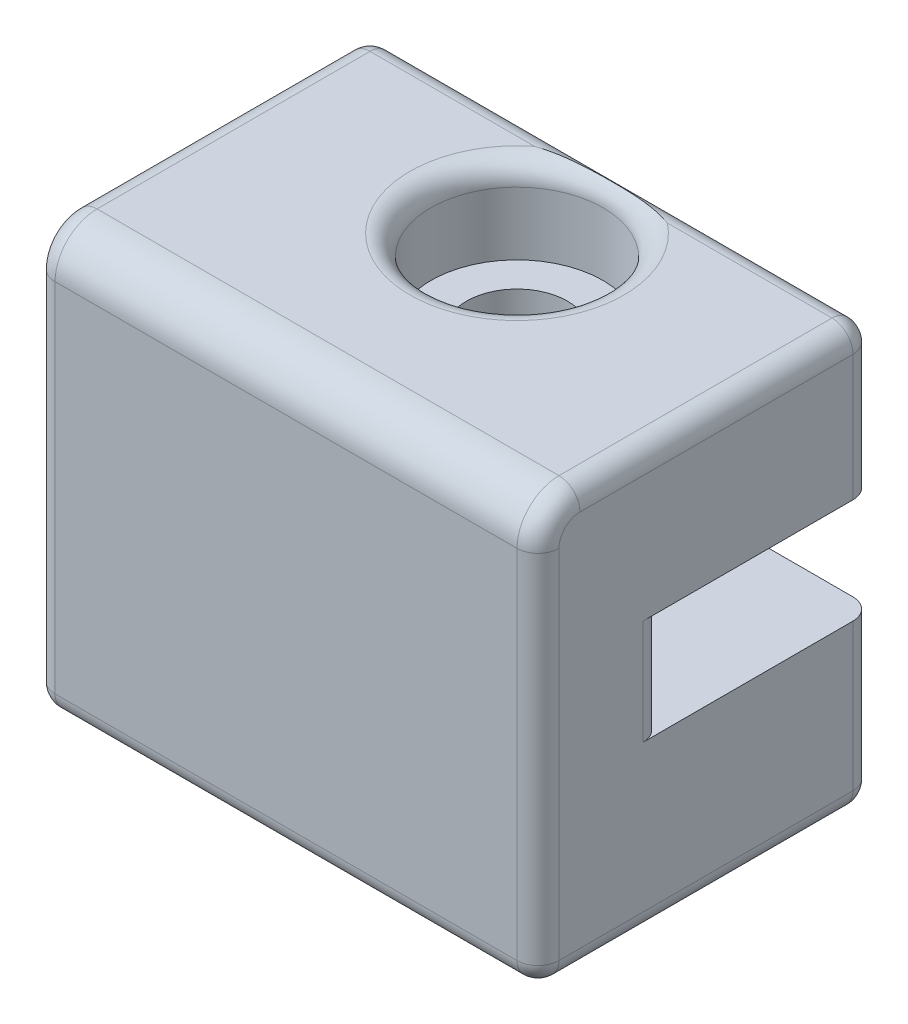
ISO-10303-21;
HEADER;
FILE_DESCRIPTION(('STEP AP214'),'2;1');
FILE_NAME('part.step','',(''),(''),'','','');
FILE_SCHEMA(('AUTOMOTIVE_DESIGN { 1 0 10303 214 1 1 1 1 }'));
ENDSEC;
DATA;
#1=APPLICATION_CONTEXT('core data for automotive mechanical design processes');
#2=APPLICATION_PROTOCOL_DEFINITION('international standard','automotive_design',2000,#1);
#3=PRODUCT_CONTEXT('',#1,'mechanical');
#4=PRODUCT('Part','Part','',(#3));
#5=PRODUCT_RELATED_PRODUCT_CATEGORY('part','',(#4));
#6=PRODUCT_DEFINITION_FORMATION('','',#4);
#7=PRODUCT_DEFINITION_CONTEXT('part definition',#1,'design');
#8=PRODUCT_DEFINITION('design','',#6,#7);
#9=PRODUCT_DEFINITION_SHAPE('','',#8);
#10=(LENGTH_UNIT() NAMED_UNIT(*) SI_UNIT(.MILLI.,.METRE.));
#11=(NAMED_UNIT(*) PLANE_ANGLE_UNIT() SI_UNIT($,.RADIAN.));
#12=(NAMED_UNIT(*) SI_UNIT($,.STERADIAN.) SOLID_ANGLE_UNIT());
#13=UNCERTAINTY_MEASURE_WITH_UNIT(LENGTH_MEASURE(1.E-05),#10,'distance_accuracy_value','');
#14=(GEOMETRIC_REPRESENTATION_CONTEXT(3) GLOBAL_UNCERTAINTY_ASSIGNED_CONTEXT((#13)) GLOBAL_UNIT_ASSIGNED_CONTEXT((#10,
#11,#12)) REPRESENTATION_CONTEXT('',''));
#15=CARTESIAN_POINT('',(0.,0.,0.));
#16=DIRECTION('',(0.,0.,1.));
#17=DIRECTION('',(1.,0.,0.));
#18=AXIS2_PLACEMENT_3D('',#15,#16,#17);
#19=CARTESIAN_POINT('',(0.,11.,0.));
#20=DIRECTION('',(0.,-1.,0.));
#21=DIRECTION('',(0.,0.,-1.));
#22=AXIS2_PLACEMENT_3D('',#19,#20,#21);
#23=CYLINDRICAL_SURFACE('',#22,1.2);
#24=CARTESIAN_POINT('',(0.,6.5,0.));
#25=DIRECTION('',(0.,-1.,0.));
#26=DIRECTION('',(0.,0.,-1.));
#27=AXIS2_PLACEMENT_3D('',#24,#25,#26);
#28=CIRCLE('',#27,1.2);
#29=CARTESIAN_POINT('',(0.,6.5,-1.2));
#30=VERTEX_POINT('',#29);
#31=EDGE_CURVE('E518',#30,#30,#28,.F.);
#32=ORIENTED_EDGE('',*,*,#31,.F.);
#33=EDGE_LOOP('',(#32));
#34=FACE_BOUND('',#33,.T.);
#35=CARTESIAN_POINT('',(0.,8.,0.));
#36=DIRECTION('',(0.,1.,0.));
#37=DIRECTION('',(0.,0.,1.));
#38=AXIS2_PLACEMENT_3D('',#35,#36,#37);
#39=CIRCLE('',#38,1.2);
#40=CARTESIAN_POINT('',(0.,8.,1.2));
#41=VERTEX_POINT('',#40);
#42=EDGE_CURVE('E544',#41,#41,#39,.T.);
#43=ORIENTED_EDGE('',*,*,#42,.T.);
#44=EDGE_LOOP('',(#43));
#45=FACE_BOUND('',#44,.T.);
#46=ADVANCED_FACE('F47',(#34,#45),#23,.F.);
#47=CARTESIAN_POINT('',(6.,4.,2.5));
#48=DIRECTION('',(-1.,0.,0.));
#49=DIRECTION('',(0.,0.,1.));
#50=AXIS2_PLACEMENT_3D('',#47,#48,#49);
#51=PLANE('',#50);
#52=CARTESIAN_POINT('',(6.,9.,4.5));
#53=DIRECTION('',(-1.,0.,0.));
#54=DIRECTION('',(0.,0.,1.));
#55=AXIS2_PLACEMENT_3D('',#52,#53,#54);
#56=CIRCLE('',#55,0.5);
#57=CARTESIAN_POINT('',(6.,9.5,4.5));
#58=VERTEX_POINT('',#57);
#59=CARTESIAN_POINT('',(6.,9.,5.));
#60=VERTEX_POINT('',#59);
#61=EDGE_CURVE('E344',#58,#60,#56,.F.);
#62=ORIENTED_EDGE('',*,*,#61,.T.);
#63=DIRECTION('',(0.,1.,0.));
#64=VECTOR('',#63,1.);
#65=CARTESIAN_POINT('',(6.,4.,5.));
#66=LINE('',#65,#64);
#67=CARTESIAN_POINT('',(6.,0.5,5.));
#68=VERTEX_POINT('',#67);
#69=EDGE_CURVE('E347',#60,#68,#66,.F.);
#70=ORIENTED_EDGE('',*,*,#69,.T.);
#71=DIRECTION('',(0.,0.,-1.));
#72=VECTOR('',#71,1.);
#73=CARTESIAN_POINT('',(6.,0.5,-2.5));
#74=LINE('',#73,#72);
#75=CARTESIAN_POINT('',(6.,0.5,-2.));
#76=VERTEX_POINT('',#75);
#77=EDGE_CURVE('E241',#68,#76,#74,.T.);
#78=ORIENTED_EDGE('',*,*,#77,.T.);
#79=DIRECTION('',(0.,-1.,0.));
#80=VECTOR('',#79,1.);
#81=CARTESIAN_POINT('',(6.,4.,-2.));
#82=LINE('',#81,#80);
#83=CARTESIAN_POINT('',(6.,4.,-2.));
#84=VERTEX_POINT('',#83);
#85=EDGE_CURVE('E244',#76,#84,#82,.F.);
#86=ORIENTED_EDGE('',*,*,#85,.T.);
#87=DIRECTION('',(0.,0.,-1.));
#88=VECTOR('',#87,1.);
#89=CARTESIAN_POINT('',(6.,4.,2.5));
#90=LINE('',#89,#88);
#91=CARTESIAN_POINT('',(6.,4.,3.));
#92=VERTEX_POINT('',#91);
#93=EDGE_CURVE('E533',#92,#84,#90,.T.);
#94=ORIENTED_EDGE('',*,*,#93,.F.);
#95=DIRECTION('',(0.,1.,0.));
#96=VECTOR('',#95,1.);
#97=CARTESIAN_POINT('',(6.,6.5,3.));
#98=LINE('',#97,#96);
#99=CARTESIAN_POINT('',(6.,6.5,3.));
#100=VERTEX_POINT('',#99);
#101=EDGE_CURVE('E247',#92,#100,#98,.T.);
#102=ORIENTED_EDGE('',*,*,#101,.T.);
#103=DIRECTION('',(0.,0.,-1.));
#104=VECTOR('',#103,1.);
#105=CARTESIAN_POINT('',(6.,6.5,5.5));
#106=LINE('',#105,#104);
#107=CARTESIAN_POINT('',(6.,6.5,-2.));
#108=VERTEX_POINT('',#107);
#109=EDGE_CURVE('E516',#100,#108,#106,.T.);
#110=ORIENTED_EDGE('',*,*,#109,.T.);
#111=DIRECTION('',(0.,-1.,0.));
#112=VECTOR('',#111,1.);
#113=CARTESIAN_POINT('',(6.,4.,-2.));
#114=LINE('',#113,#112);
#115=CARTESIAN_POINT('',(6.,9.5,-2.));
#116=VERTEX_POINT('',#115);
#117=EDGE_CURVE('E341',#108,#116,#114,.F.);
#118=ORIENTED_EDGE('',*,*,#117,.T.);
#119=DIRECTION('',(0.,0.,-1.));
#120=VECTOR('',#119,1.);
#121=CARTESIAN_POINT('',(6.,9.5,2.5));
#122=LINE('',#121,#120);
#123=EDGE_CURVE('E338',#116,#58,#122,.F.);
#124=ORIENTED_EDGE('',*,*,#123,.T.);
#125=EDGE_LOOP('',(#62,#70,#78,#86,#94,#102,#110,#118,#124));
#126=FACE_BOUND('',#125,.T.);
#127=ADVANCED_FACE('F475',(#126),#51,.F.);
#128=CARTESIAN_POINT('',(-6.,4.,-2.5));
#129=DIRECTION('',(0.,0.,1.));
#130=DIRECTION('',(1.,0.,0.));
#131=AXIS2_PLACEMENT_3D('',#128,#129,#130);
#132=PLANE('',#131);
#133=DIRECTION('',(-1.,0.,0.));
#134=VECTOR('',#133,1.);
#135=CARTESIAN_POINT('',(-6.,0.5,-2.5));
#136=LINE('',#135,#134);
#137=CARTESIAN_POINT('',(5.5,0.5,-2.5));
#138=VERTEX_POINT('',#137);
#139=CARTESIAN_POINT('',(-5.5,0.5,-2.5));
#140=VERTEX_POINT('',#139);
#141=EDGE_CURVE('E251',#138,#140,#136,.T.);
#142=ORIENTED_EDGE('',*,*,#141,.T.);
#143=DIRECTION('',(0.,-1.,0.));
#144=VECTOR('',#143,1.);
#145=CARTESIAN_POINT('',(-5.5,4.,-2.5));
#146=LINE('',#145,#144);
#147=CARTESIAN_POINT('',(-5.5,4.,-2.5));
#148=VERTEX_POINT('',#147);
#149=EDGE_CURVE('E257',#140,#148,#146,.F.);
#150=ORIENTED_EDGE('',*,*,#149,.T.);
#151=DIRECTION('',(-1.,0.,0.));
#152=VECTOR('',#151,1.);
#153=CARTESIAN_POINT('',(-6.,4.,-2.5));
#154=LINE('',#153,#152);
#155=CARTESIAN_POINT('',(5.5,4.,-2.5));
#156=VERTEX_POINT('',#155);
#157=EDGE_CURVE('E203',#156,#148,#154,.T.);
#158=ORIENTED_EDGE('',*,*,#157,.F.);
#159=DIRECTION('',(0.,-1.,0.));
#160=VECTOR('',#159,1.);
#161=CARTESIAN_POINT('',(5.5,4.,-2.5));
#162=LINE('',#161,#160);
#163=EDGE_CURVE('E254',#156,#138,#162,.T.);
#164=ORIENTED_EDGE('',*,*,#163,.T.);
#165=EDGE_LOOP('',(#142,#150,#158,#164));
#166=FACE_BOUND('',#165,.T.);
#167=ADVANCED_FACE('F484',(#166),#132,.F.);
#168=CARTESIAN_POINT('',(-6.,4.,2.5));
#169=DIRECTION('',(1.,0.,0.));
#170=DIRECTION('',(0.,0.,-1.));
#171=AXIS2_PLACEMENT_3D('',#168,#169,#170);
#172=PLANE('',#171);
#173=DIRECTION('',(0.,0.,1.));
#174=VECTOR('',#173,1.);
#175=CARTESIAN_POINT('',(-6.,0.5,5.5));
#176=LINE('',#175,#174);
#177=CARTESIAN_POINT('',(-6.,0.5,-2.));
#178=VERTEX_POINT('',#177);
#179=CARTESIAN_POINT('',(-6.,0.5,5.));
#180=VERTEX_POINT('',#179);
#181=EDGE_CURVE('E227',#178,#180,#176,.T.);
#182=ORIENTED_EDGE('',*,*,#181,.T.);
#183=DIRECTION('',(0.,-1.,0.));
#184=VECTOR('',#183,1.);
#185=CARTESIAN_POINT('',(-6.,4.,5.));
#186=LINE('',#185,#184);
#187=CARTESIAN_POINT('',(-6.,9.,5.));
#188=VERTEX_POINT('',#187);
#189=EDGE_CURVE('E368',#180,#188,#186,.F.);
#190=ORIENTED_EDGE('',*,*,#189,.T.);
#191=CARTESIAN_POINT('',(-6.,9.,4.5));
#192=DIRECTION('',(1.,0.,0.));
#193=DIRECTION('',(0.,0.,-1.));
#194=AXIS2_PLACEMENT_3D('',#191,#192,#193);
#195=CIRCLE('',#194,0.5);
#196=CARTESIAN_POINT('',(-6.,9.5,4.5));
#197=VERTEX_POINT('',#196);
#198=EDGE_CURVE('E365',#188,#197,#195,.F.);
#199=ORIENTED_EDGE('',*,*,#198,.T.);
#200=DIRECTION('',(0.,0.,1.));
#201=VECTOR('',#200,1.);
#202=CARTESIAN_POINT('',(-6.,9.5,2.5));
#203=LINE('',#202,#201);
#204=CARTESIAN_POINT('',(-6.,9.5,-2.));
#205=VERTEX_POINT('',#204);
#206=EDGE_CURVE('E362',#197,#205,#203,.F.);
#207=ORIENTED_EDGE('',*,*,#206,.T.);
#208=DIRECTION('',(0.,-1.,0.));
#209=VECTOR('',#208,1.);
#210=CARTESIAN_POINT('',(-6.,4.,-2.));
#211=LINE('',#210,#209);
#212=CARTESIAN_POINT('',(-6.,6.5,-2.));
#213=VERTEX_POINT('',#212);
#214=EDGE_CURVE('E359',#205,#213,#211,.T.);
#215=ORIENTED_EDGE('',*,*,#214,.T.);
#216=DIRECTION('',(0.,0.,1.));
#217=VECTOR('',#216,1.);
#218=CARTESIAN_POINT('',(-6.,6.5,5.5));
#219=LINE('',#218,#217);
#220=CARTESIAN_POINT('',(-6.,6.5,3.));
#221=VERTEX_POINT('',#220);
#222=EDGE_CURVE('E512',#213,#221,#219,.T.);
#223=ORIENTED_EDGE('',*,*,#222,.T.);
#224=DIRECTION('',(0.,-1.,0.));
#225=VECTOR('',#224,1.);
#226=CARTESIAN_POINT('',(-6.,4.,3.));
#227=LINE('',#226,#225);
#228=CARTESIAN_POINT('',(-6.,4.,3.));
#229=VERTEX_POINT('',#228);
#230=EDGE_CURVE('E218',#221,#229,#227,.T.);
#231=ORIENTED_EDGE('',*,*,#230,.T.);
#232=DIRECTION('',(0.,0.,1.));
#233=VECTOR('',#232,1.);
#234=CARTESIAN_POINT('',(-6.,4.,2.5));
#235=LINE('',#234,#233);
#236=CARTESIAN_POINT('',(-6.,4.,-2.));
#237=VERTEX_POINT('',#236);
#238=EDGE_CURVE('E200',#237,#229,#235,.T.);
#239=ORIENTED_EDGE('',*,*,#238,.F.);
#240=DIRECTION('',(0.,-1.,0.));
#241=VECTOR('',#240,1.);
#242=CARTESIAN_POINT('',(-6.,4.,-2.));
#243=LINE('',#242,#241);
#244=EDGE_CURVE('E216',#237,#178,#243,.T.);
#245=ORIENTED_EDGE('',*,*,#244,.T.);
#246=EDGE_LOOP('',(#182,#190,#199,#207,#215,#223,#231,#239,#245));
#247=FACE_BOUND('',#246,.T.);
#248=ADVANCED_FACE('F215',(#247),#172,.F.);
#249=CARTESIAN_POINT('',(0.,4.,0.));
#250=DIRECTION('',(0.,-1.,0.));
#251=DIRECTION('',(0.,0.,-1.));
#252=AXIS2_PLACEMENT_3D('',#249,#250,#251);
#253=PLANE('',#252);
#254=CARTESIAN_POINT('',(0.,4.,0.));
#255=DIRECTION('',(0.,-1.,0.));
#256=DIRECTION('',(0.,0.,-1.));
#257=AXIS2_PLACEMENT_3D('',#254,#255,#256);
#258=CIRCLE('',#257,1.2);
#259=CARTESIAN_POINT('',(0.,4.,-1.2));
#260=VERTEX_POINT('',#259);
#261=EDGE_CURVE('E509',#260,#260,#258,.F.);
#262=ORIENTED_EDGE('',*,*,#261,.F.);
#263=EDGE_LOOP('',(#262));
#264=FACE_BOUND('',#263,.T.);
#265=ORIENTED_EDGE('',*,*,#157,.T.);
#266=CARTESIAN_POINT('',(-5.5,4.,-2.));
#267=DIRECTION('',(0.,-1.,0.));
#268=DIRECTION('',(0.,0.,-1.));
#269=AXIS2_PLACEMENT_3D('',#266,#267,#268);
#270=CIRCLE('',#269,0.5);
#271=EDGE_CURVE('E197',#148,#237,#270,.F.);
#272=ORIENTED_EDGE('',*,*,#271,.T.);
#273=ORIENTED_EDGE('',*,*,#238,.T.);
#274=CARTESIAN_POINT('',(-5.5,4.,3.));
#275=DIRECTION('',(0.,-1.,0.));
#276=DIRECTION('',(0.,0.,-1.));
#277=AXIS2_PLACEMENT_3D('',#274,#275,#276);
#278=CIRCLE('',#277,0.5);
#279=CARTESIAN_POINT('',(-5.5,4.,2.5));
#280=VERTEX_POINT('',#279);
#281=EDGE_CURVE('E280',#229,#280,#278,.T.);
#282=ORIENTED_EDGE('',*,*,#281,.T.);
#283=DIRECTION('',(1.,0.,0.));
#284=VECTOR('',#283,1.);
#285=CARTESIAN_POINT('',(-6.,4.,2.5));
#286=LINE('',#285,#284);
#287=CARTESIAN_POINT('',(5.5,4.,2.5));
#288=VERTEX_POINT('',#287);
#289=EDGE_CURVE('E220',#280,#288,#286,.T.);
#290=ORIENTED_EDGE('',*,*,#289,.T.);
#291=CARTESIAN_POINT('',(5.5,4.,3.));
#292=DIRECTION('',(0.,-1.,0.));
#293=DIRECTION('',(0.,0.,-1.));
#294=AXIS2_PLACEMENT_3D('',#291,#292,#293);
#295=CIRCLE('',#294,0.5);
#296=EDGE_CURVE('E290',#288,#92,#295,.T.);
#297=ORIENTED_EDGE('',*,*,#296,.T.);
#298=ORIENTED_EDGE('',*,*,#93,.T.);
#299=CARTESIAN_POINT('',(5.5,4.,-2.));
#300=DIRECTION('',(0.,-1.,0.));
#301=DIRECTION('',(0.,0.,-1.));
#302=AXIS2_PLACEMENT_3D('',#299,#300,#301);
#303=CIRCLE('',#302,0.5);
#304=EDGE_CURVE('E209',#84,#156,#303,.F.);
#305=ORIENTED_EDGE('',*,*,#304,.T.);
#306=EDGE_LOOP('',(#265,#272,#273,#282,#290,#297,#298,#305));
#307=FACE_BOUND('',#306,.T.);
#308=ADVANCED_FACE('F199',(#264,#307),#253,.F.);
#309=CARTESIAN_POINT('',(0.,0.,0.));
#310=DIRECTION('',(0.,-1.,0.));
#311=DIRECTION('',(0.,0.,-1.));
#312=AXIS2_PLACEMENT_3D('',#309,#310,#311);
#313=PLANE('',#312);
#314=DIRECTION('',(0.,0.,1.));
#315=VECTOR('',#314,1.);
#316=CARTESIAN_POINT('',(-5.5,0.,-2.5));
#317=LINE('',#316,#315);
#318=CARTESIAN_POINT('',(-5.5,0.,5.));
#319=VERTEX_POINT('',#318);
#320=CARTESIAN_POINT('',(-5.5,0.,-2.));
#321=VERTEX_POINT('',#320);
#322=EDGE_CURVE('E269',#319,#321,#317,.F.);
#323=ORIENTED_EDGE('',*,*,#322,.T.);
#324=DIRECTION('',(-1.,0.,0.));
#325=VECTOR('',#324,1.);
#326=CARTESIAN_POINT('',(6.,0.,-2.));
#327=LINE('',#326,#325);
#328=CARTESIAN_POINT('',(5.5,0.,-2.));
#329=VERTEX_POINT('',#328);
#330=EDGE_CURVE('E272',#321,#329,#327,.F.);
#331=ORIENTED_EDGE('',*,*,#330,.T.);
#332=DIRECTION('',(0.,0.,-1.));
#333=VECTOR('',#332,1.);
#334=CARTESIAN_POINT('',(5.5,0.,5.5));
#335=LINE('',#334,#333);
#336=CARTESIAN_POINT('',(5.5,0.,5.));
#337=VERTEX_POINT('',#336);
#338=EDGE_CURVE('E265',#329,#337,#335,.F.);
#339=ORIENTED_EDGE('',*,*,#338,.T.);
#340=DIRECTION('',(1.,0.,0.));
#341=VECTOR('',#340,1.);
#342=CARTESIAN_POINT('',(-6.,0.,5.));
#343=LINE('',#342,#341);
#344=EDGE_CURVE('E208',#337,#319,#343,.F.);
#345=ORIENTED_EDGE('',*,*,#344,.T.);
#346=EDGE_LOOP('',(#323,#331,#339,#345));
#347=FACE_BOUND('',#346,.T.);
#348=CARTESIAN_POINT('',(0.,0.,0.));
#349=DIRECTION('',(0.,-1.,0.));
#350=DIRECTION('',(0.,0.,-1.));
#351=AXIS2_PLACEMENT_3D('',#348,#349,#350);
#352=CIRCLE('',#351,1.2);
#353=CARTESIAN_POINT('',(0.,0.,-1.2));
#354=VERTEX_POINT('',#353);
#355=EDGE_CURVE('E506',#354,#354,#352,.F.);
#356=ORIENTED_EDGE('',*,*,#355,.T.);
#357=EDGE_LOOP('',(#356));
#358=FACE_BOUND('',#357,.T.);
#359=ADVANCED_FACE('F672',(#347,#358),#313,.T.);
#360=CARTESIAN_POINT('',(0.,0.,2.5));
#361=DIRECTION('',(0.,0.,-1.));
#362=DIRECTION('',(-1.,0.,0.));
#363=AXIS2_PLACEMENT_3D('',#360,#361,#362);
#364=PLANE('',#363);
#365=ORIENTED_EDGE('',*,*,#289,.F.);
#366=DIRECTION('',(0.,-1.,0.));
#367=VECTOR('',#366,1.);
#368=CARTESIAN_POINT('',(-5.5,6.5,2.5));
#369=LINE('',#368,#367);
#370=CARTESIAN_POINT('',(-5.5,6.5,2.5));
#371=VERTEX_POINT('',#370);
#372=EDGE_CURVE('E238',#280,#371,#369,.F.);
#373=ORIENTED_EDGE('',*,*,#372,.T.);
#374=DIRECTION('',(-1.,0.,0.));
#375=VECTOR('',#374,1.);
#376=CARTESIAN_POINT('',(-6.,6.5,2.5));
#377=LINE('',#376,#375);
#378=CARTESIAN_POINT('',(5.5,6.5,2.5));
#379=VERTEX_POINT('',#378);
#380=EDGE_CURVE('E529',#379,#371,#377,.T.);
#381=ORIENTED_EDGE('',*,*,#380,.F.);
#382=DIRECTION('',(0.,1.,0.));
#383=VECTOR('',#382,1.);
#384=CARTESIAN_POINT('',(5.5,4.,2.5));
#385=LINE('',#384,#383);
#386=EDGE_CURVE('E231',#379,#288,#385,.F.);
#387=ORIENTED_EDGE('',*,*,#386,.T.);
#388=EDGE_LOOP('',(#365,#373,#381,#387));
#389=FACE_BOUND('',#388,.T.);
#390=ADVANCED_FACE('F642',(#389),#364,.T.);
#391=CARTESIAN_POINT('',(0.,0.,5.5));
#392=DIRECTION('',(0.,0.,-1.));
#393=DIRECTION('',(-1.,0.,0.));
#394=AXIS2_PLACEMENT_3D('',#391,#392,#393);
#395=PLANE('',#394);
#396=DIRECTION('',(1.,0.,0.));
#397=VECTOR('',#396,1.);
#398=CARTESIAN_POINT('',(6.,0.5,5.5));
#399=LINE('',#398,#397);
#400=CARTESIAN_POINT('',(-5.5,0.5,5.5));
#401=VERTEX_POINT('',#400);
#402=CARTESIAN_POINT('',(5.5,0.5,5.5));
#403=VERTEX_POINT('',#402);
#404=EDGE_CURVE('E276',#401,#403,#399,.T.);
#405=ORIENTED_EDGE('',*,*,#404,.T.);
#406=DIRECTION('',(0.,1.,0.));
#407=VECTOR('',#406,1.);
#408=CARTESIAN_POINT('',(5.5,0.,5.5));
#409=LINE('',#408,#407);
#410=CARTESIAN_POINT('',(5.5,9.,5.5));
#411=VERTEX_POINT('',#410);
#412=EDGE_CURVE('E335',#403,#411,#409,.T.);
#413=ORIENTED_EDGE('',*,*,#412,.T.);
#414=DIRECTION('',(1.,0.,0.));
#415=VECTOR('',#414,1.);
#416=CARTESIAN_POINT('',(0.,9.,5.5));
#417=LINE('',#416,#415);
#418=CARTESIAN_POINT('',(-5.5,9.,5.5));
#419=VERTEX_POINT('',#418);
#420=EDGE_CURVE('E318',#411,#419,#417,.F.);
#421=ORIENTED_EDGE('',*,*,#420,.T.);
#422=DIRECTION('',(0.,-1.,0.));
#423=VECTOR('',#422,1.);
#424=CARTESIAN_POINT('',(-5.5,0.,5.5));
#425=LINE('',#424,#423);
#426=EDGE_CURVE('E332',#419,#401,#425,.T.);
#427=ORIENTED_EDGE('',*,*,#426,.T.);
#428=EDGE_LOOP('',(#405,#413,#421,#427));
#429=FACE_BOUND('',#428,.T.);
#430=ADVANCED_FACE('F722',(#429),#395,.F.);
#431=CARTESIAN_POINT('',(-6.,10.,-2.5));
#432=DIRECTION('',(0.,0.,1.));
#433=DIRECTION('',(1.,0.,0.));
#434=AXIS2_PLACEMENT_3D('',#431,#432,#433);
#435=PLANE('',#434);
#436=DIRECTION('',(-1.,0.,0.));
#437=VECTOR('',#436,1.);
#438=CARTESIAN_POINT('',(-6.,9.5,-2.5));
#439=LINE('',#438,#437);
#440=CARTESIAN_POINT('',(-5.5,9.5,-2.5));
#441=VERTEX_POINT('',#440);
#442=CARTESIAN_POINT('',(5.5,9.5,-2.5));
#443=VERTEX_POINT('',#442);
#444=EDGE_CURVE('E374',#441,#443,#439,.F.);
#445=ORIENTED_EDGE('',*,*,#444,.T.);
#446=DIRECTION('',(0.,-1.,0.));
#447=VECTOR('',#446,1.);
#448=CARTESIAN_POINT('',(5.5,10.,-2.5));
#449=LINE('',#448,#447);
#450=CARTESIAN_POINT('',(5.5,6.5,-2.5));
#451=VERTEX_POINT('',#450);
#452=EDGE_CURVE('E377',#443,#451,#449,.T.);
#453=ORIENTED_EDGE('',*,*,#452,.T.);
#454=DIRECTION('',(-1.,0.,0.));
#455=VECTOR('',#454,1.);
#456=CARTESIAN_POINT('',(-6.,6.5,-2.5));
#457=LINE('',#456,#455);
#458=CARTESIAN_POINT('',(-5.5,6.5,-2.5));
#459=VERTEX_POINT('',#458);
#460=EDGE_CURVE('E525',#451,#459,#457,.T.);
#461=ORIENTED_EDGE('',*,*,#460,.T.);
#462=DIRECTION('',(0.,-1.,0.));
#463=VECTOR('',#462,1.);
#464=CARTESIAN_POINT('',(-5.5,10.,-2.5));
#465=LINE('',#464,#463);
#466=EDGE_CURVE('E371',#459,#441,#465,.F.);
#467=ORIENTED_EDGE('',*,*,#466,.T.);
#468=EDGE_LOOP('',(#445,#453,#461,#467));
#469=FACE_BOUND('',#468,.T.);
#470=ADVANCED_FACE('F653',(#469),#435,.F.);
#471=CARTESIAN_POINT('',(0.,10.,0.));
#472=DIRECTION('',(0.,-1.,0.));
#473=DIRECTION('',(0.,0.,-1.));
#474=AXIS2_PLACEMENT_3D('',#471,#472,#473);
#475=PLANE('',#474);
#476=DIRECTION('',(1.,0.,0.));
#477=VECTOR('',#476,1.);
#478=CARTESIAN_POINT('',(0.,10.,4.5));
#479=LINE('',#478,#477);
#480=CARTESIAN_POINT('',(-5.5,10.,4.5));
#481=VERTEX_POINT('',#480);
#482=CARTESIAN_POINT('',(5.5,10.,4.5));
#483=VERTEX_POINT('',#482);
#484=EDGE_CURVE('E294',#481,#483,#479,.T.);
#485=ORIENTED_EDGE('',*,*,#484,.T.);
#486=DIRECTION('',(0.,0.,-1.));
#487=VECTOR('',#486,1.);
#488=CARTESIAN_POINT('',(5.5,10.,0.));
#489=LINE('',#488,#487);
#490=CARTESIAN_POINT('',(5.5,10.,-2.));
#491=VERTEX_POINT('',#490);
#492=EDGE_CURVE('E57',#483,#491,#489,.T.);
#493=ORIENTED_EDGE('',*,*,#492,.T.);
#494=DIRECTION('',(-1.,0.,0.));
#495=VECTOR('',#494,1.);
#496=CARTESIAN_POINT('',(0.,10.,-2.));
#497=LINE('',#496,#495);
#498=CARTESIAN_POINT('',(1.58192920195564,10.,-2.));
#499=VERTEX_POINT('',#498);
#500=EDGE_CURVE('E68',#491,#499,#497,.T.);
#501=ORIENTED_EDGE('',*,*,#500,.T.);
#502=CARTESIAN_POINT('',(0.,10.,0.));
#503=DIRECTION('',(0.,-1.,0.));
#504=DIRECTION('',(0.,0.,-1.));
#505=AXIS2_PLACEMENT_3D('',#502,#503,#504);
#506=CIRCLE('',#505,2.55);
#507=CARTESIAN_POINT('',(-1.58192920195564,10.,-2.));
#508=VERTEX_POINT('',#507);
#509=EDGE_CURVE('E392',#499,#508,#506,.T.);
#510=ORIENTED_EDGE('',*,*,#509,.T.);
#511=DIRECTION('',(-1.,0.,0.));
#512=VECTOR('',#511,1.);
#513=CARTESIAN_POINT('',(0.,10.,-2.));
#514=LINE('',#513,#512);
#515=CARTESIAN_POINT('',(-5.5,10.,-2.));
#516=VERTEX_POINT('',#515);
#517=EDGE_CURVE('E389',#508,#516,#514,.T.);
#518=ORIENTED_EDGE('',*,*,#517,.T.);
#519=DIRECTION('',(0.,0.,1.));
#520=VECTOR('',#519,1.);
#521=CARTESIAN_POINT('',(-5.5,10.,0.));
#522=LINE('',#521,#520);
#523=EDGE_CURVE('E386',#516,#481,#522,.T.);
#524=ORIENTED_EDGE('',*,*,#523,.T.);
#525=EDGE_LOOP('',(#485,#493,#501,#510,#518,#524));
#526=FACE_BOUND('',#525,.T.);
#527=ADVANCED_FACE('F500',(#526),#475,.F.);
#528=CARTESIAN_POINT('',(0.,6.5,0.));
#529=DIRECTION('',(0.,-1.,0.));
#530=DIRECTION('',(0.,0.,-1.));
#531=AXIS2_PLACEMENT_3D('',#528,#529,#530);
#532=PLANE('',#531);
#533=ORIENTED_EDGE('',*,*,#31,.T.);
#534=EDGE_LOOP('',(#533));
#535=FACE_BOUND('',#534,.T.);
#536=ORIENTED_EDGE('',*,*,#460,.F.);
#537=CARTESIAN_POINT('',(5.5,6.5,-2.));
#538=DIRECTION('',(0.,-1.,0.));
#539=DIRECTION('',(0.,0.,-1.));
#540=AXIS2_PLACEMENT_3D('',#537,#538,#539);
#541=CIRCLE('',#540,0.5);
#542=EDGE_CURVE('E383',#451,#108,#541,.T.);
#543=ORIENTED_EDGE('',*,*,#542,.T.);
#544=ORIENTED_EDGE('',*,*,#109,.F.);
#545=CARTESIAN_POINT('',(5.5,6.5,3.));
#546=DIRECTION('',(0.,-1.,0.));
#547=DIRECTION('',(0.,0.,-1.));
#548=AXIS2_PLACEMENT_3D('',#545,#546,#547);
#549=CIRCLE('',#548,0.5);
#550=EDGE_CURVE('E287',#100,#379,#549,.F.);
#551=ORIENTED_EDGE('',*,*,#550,.T.);
#552=ORIENTED_EDGE('',*,*,#380,.T.);
#553=CARTESIAN_POINT('',(-5.5,6.5,3.));
#554=DIRECTION('',(0.,-1.,0.));
#555=DIRECTION('',(0.,0.,-1.));
#556=AXIS2_PLACEMENT_3D('',#553,#554,#555);
#557=CIRCLE('',#556,0.5);
#558=EDGE_CURVE('E283',#371,#221,#557,.F.);
#559=ORIENTED_EDGE('',*,*,#558,.T.);
#560=ORIENTED_EDGE('',*,*,#222,.F.);
#561=CARTESIAN_POINT('',(-5.5,6.5,-2.));
#562=DIRECTION('',(0.,-1.,0.));
#563=DIRECTION('',(0.,0.,-1.));
#564=AXIS2_PLACEMENT_3D('',#561,#562,#563);
#565=CIRCLE('',#564,0.5);
#566=EDGE_CURVE('E380',#213,#459,#565,.T.);
#567=ORIENTED_EDGE('',*,*,#566,.T.);
#568=EDGE_LOOP('',(#536,#543,#544,#551,#552,#559,#560,#567));
#569=FACE_BOUND('',#568,.T.);
#570=ADVANCED_FACE('F492',(#535,#569),#532,.T.);
#571=ORIENTED_EDGE('',*,*,#355,.F.);
#572=EDGE_LOOP('',(#571));
#573=FACE_BOUND('',#572,.T.);
#574=ORIENTED_EDGE('',*,*,#261,.T.);
#575=EDGE_LOOP('',(#574));
#576=FACE_BOUND('',#575,.T.);
#577=ADVANCED_FACE('F478',(#573,#576),#23,.F.);
#578=CARTESIAN_POINT('',(0.,8.,0.));
#579=DIRECTION('',(0.,1.,0.));
#580=DIRECTION('',(0.,0.,1.));
#581=AXIS2_PLACEMENT_3D('',#578,#579,#580);
#582=CYLINDRICAL_SURFACE('',#581,2.05);
#583=CARTESIAN_POINT('',(0.,9.5,0.));
#584=DIRECTION('',(0.,-1.,0.));
#585=DIRECTION('',(0.,0.,-1.));
#586=AXIS2_PLACEMENT_3D('',#583,#584,#585);
#587=CIRCLE('',#586,2.05);
#588=CARTESIAN_POINT('',(0.,9.5,-2.05));
#589=VERTEX_POINT('',#588);
#590=EDGE_CURVE('E11',#589,#589,#587,.F.);
#591=ORIENTED_EDGE('',*,*,#590,.T.);
#592=EDGE_LOOP('',(#591));
#593=FACE_BOUND('',#592,.T.);
#594=CARTESIAN_POINT('',(0.,8.,0.));
#595=DIRECTION('',(0.,1.,0.));
#596=DIRECTION('',(0.,0.,1.));
#597=AXIS2_PLACEMENT_3D('',#594,#595,#596);
#598=CIRCLE('',#597,2.05);
#599=CARTESIAN_POINT('',(0.,8.,2.05));
#600=VERTEX_POINT('',#599);
#601=EDGE_CURVE('E315',#600,#600,#598,.T.);
#602=ORIENTED_EDGE('',*,*,#601,.F.);
#603=EDGE_LOOP('',(#602));
#604=FACE_BOUND('',#603,.T.);
#605=ADVANCED_FACE('F491',(#593,#604),#582,.F.);
#606=CARTESIAN_POINT('',(0.,8.,0.));
#607=DIRECTION('',(0.,1.,0.));
#608=DIRECTION('',(0.,0.,1.));
#609=AXIS2_PLACEMENT_3D('',#606,#607,#608);
#610=PLANE('',#609);
#611=ORIENTED_EDGE('',*,*,#42,.F.);
#612=EDGE_LOOP('',(#611));
#613=FACE_BOUND('',#612,.T.);
#614=ORIENTED_EDGE('',*,*,#601,.T.);
#615=EDGE_LOOP('',(#614));
#616=FACE_BOUND('',#615,.T.);
#617=ADVANCED_FACE('F497',(#613,#616),#610,.T.);
#618=CARTESIAN_POINT('',(-5.5,4.,3.));
#619=DIRECTION('',(0.,1.,0.));
#620=DIRECTION('',(0.,0.,1.));
#621=AXIS2_PLACEMENT_3D('',#618,#619,#620);
#622=CYLINDRICAL_SURFACE('',#621,0.5);
#623=ORIENTED_EDGE('',*,*,#558,.F.);
#624=ORIENTED_EDGE('',*,*,#372,.F.);
#625=ORIENTED_EDGE('',*,*,#281,.F.);
#626=ORIENTED_EDGE('',*,*,#230,.F.);
#627=EDGE_LOOP('',(#623,#624,#625,#626));
#628=FACE_BOUND('',#627,.T.);
#629=ADVANCED_FACE('F553',(#628),#622,.T.);
#630=CARTESIAN_POINT('',(5.5,4.,3.));
#631=DIRECTION('',(0.,-1.,0.));
#632=DIRECTION('',(0.,0.,-1.));
#633=AXIS2_PLACEMENT_3D('',#630,#631,#632);
#634=CYLINDRICAL_SURFACE('',#633,0.5);
#635=ORIENTED_EDGE('',*,*,#296,.F.);
#636=ORIENTED_EDGE('',*,*,#386,.F.);
#637=ORIENTED_EDGE('',*,*,#550,.F.);
#638=ORIENTED_EDGE('',*,*,#101,.F.);
#639=EDGE_LOOP('',(#635,#636,#637,#638));
#640=FACE_BOUND('',#639,.T.);
#641=ADVANCED_FACE('F560',(#640),#634,.T.);
#642=CARTESIAN_POINT('',(5.5,0.5,2.5));
#643=DIRECTION('',(0.,0.,1.));
#644=DIRECTION('',(1.,0.,0.));
#645=AXIS2_PLACEMENT_3D('',#642,#643,#644);
#646=CYLINDRICAL_SURFACE('',#645,0.5);
#647=ORIENTED_EDGE('',*,*,#77,.F.);
#648=CARTESIAN_POINT('',(5.5,0.5,5.));
#649=DIRECTION('',(0.,0.,1.));
#650=DIRECTION('',(1.,0.,0.));
#651=AXIS2_PLACEMENT_3D('',#648,#649,#650);
#652=CIRCLE('',#651,0.5);
#653=EDGE_CURVE('E329',#68,#337,#652,.F.);
#654=ORIENTED_EDGE('',*,*,#653,.T.);
#655=ORIENTED_EDGE('',*,*,#338,.F.);
#656=CARTESIAN_POINT('',(5.5,0.5,-2.));
#657=DIRECTION('',(0.,0.,-1.));
#658=DIRECTION('',(-1.,0.,0.));
#659=AXIS2_PLACEMENT_3D('',#656,#657,#658);
#660=CIRCLE('',#659,0.5);
#661=EDGE_CURVE('E311',#76,#329,#660,.T.);
#662=ORIENTED_EDGE('',*,*,#661,.F.);
#663=EDGE_LOOP('',(#647,#654,#655,#662));
#664=FACE_BOUND('',#663,.T.);
#665=ADVANCED_FACE('F567',(#664),#646,.T.);
#666=CARTESIAN_POINT('',(5.5,4.,-2.));
#667=DIRECTION('',(0.,-1.,0.));
#668=DIRECTION('',(0.,0.,-1.));
#669=AXIS2_PLACEMENT_3D('',#666,#667,#668);
#670=CYLINDRICAL_SURFACE('',#669,0.5);
#671=ORIENTED_EDGE('',*,*,#304,.F.);
#672=ORIENTED_EDGE('',*,*,#85,.F.);
#673=CARTESIAN_POINT('',(5.5,0.5,-2.));
#674=DIRECTION('',(0.,-1.,0.));
#675=DIRECTION('',(0.,0.,-1.));
#676=AXIS2_PLACEMENT_3D('',#673,#674,#675);
#677=CIRCLE('',#676,0.5);
#678=EDGE_CURVE('E307',#138,#76,#677,.T.);
#679=ORIENTED_EDGE('',*,*,#678,.F.);
#680=ORIENTED_EDGE('',*,*,#163,.F.);
#681=EDGE_LOOP('',(#671,#672,#679,#680));
#682=FACE_BOUND('',#681,.T.);
#683=ADVANCED_FACE('F594',(#682),#670,.T.);
#684=CARTESIAN_POINT('',(0.,0.5,5.));
#685=DIRECTION('',(-1.,0.,0.));
#686=DIRECTION('',(0.,0.,1.));
#687=AXIS2_PLACEMENT_3D('',#684,#685,#686);
#688=CYLINDRICAL_SURFACE('',#687,0.5);
#689=ORIENTED_EDGE('',*,*,#344,.F.);
#690=CARTESIAN_POINT('',(5.5,0.5,5.));
#691=DIRECTION('',(-1.,0.,0.));
#692=DIRECTION('',(0.,0.,1.));
#693=AXIS2_PLACEMENT_3D('',#690,#691,#692);
#694=CIRCLE('',#693,0.5);
#695=EDGE_CURVE('E325',#337,#403,#694,.T.);
#696=ORIENTED_EDGE('',*,*,#695,.T.);
#697=ORIENTED_EDGE('',*,*,#404,.F.);
#698=CARTESIAN_POINT('',(-5.5,0.5,5.));
#699=DIRECTION('',(-1.,0.,0.));
#700=DIRECTION('',(0.,0.,1.));
#701=AXIS2_PLACEMENT_3D('',#698,#699,#700);
#702=CIRCLE('',#701,0.5);
#703=EDGE_CURVE('E322',#401,#319,#702,.F.);
#704=ORIENTED_EDGE('',*,*,#703,.T.);
#705=EDGE_LOOP('',(#689,#696,#697,#704));
#706=FACE_BOUND('',#705,.T.);
#707=ADVANCED_FACE('F590',(#706),#688,.T.);
#708=CARTESIAN_POINT('',(5.5,0.5,-2.));
#709=DIRECTION('',(1.,0.,0.));
#710=DIRECTION('',(0.,0.,-1.));
#711=AXIS2_PLACEMENT_3D('',#708,#709,#710);
#712=SPHERICAL_SURFACE('',#711,0.5);
#713=ORIENTED_EDGE('',*,*,#678,.T.);
#714=ORIENTED_EDGE('',*,*,#661,.T.);
#715=CARTESIAN_POINT('',(5.5,0.5,-2.));
#716=DIRECTION('',(1.,0.,0.));
#717=DIRECTION('',(0.,0.,-1.));
#718=AXIS2_PLACEMENT_3D('',#715,#716,#717);
#719=CIRCLE('',#718,0.5);
#720=EDGE_CURVE('E304',#138,#329,#719,.F.);
#721=ORIENTED_EDGE('',*,*,#720,.F.);
#722=EDGE_LOOP('',(#713,#714,#721));
#723=FACE_BOUND('',#722,.T.);
#724=ADVANCED_FACE('F586',(#723),#712,.T.);
#725=CARTESIAN_POINT('',(-5.5,0.5,2.5));
#726=DIRECTION('',(0.,0.,-1.));
#727=DIRECTION('',(-1.,0.,0.));
#728=AXIS2_PLACEMENT_3D('',#725,#726,#727);
#729=CYLINDRICAL_SURFACE('',#728,0.5);
#730=ORIENTED_EDGE('',*,*,#322,.F.);
#731=CARTESIAN_POINT('',(-5.5,0.5,5.));
#732=DIRECTION('',(0.,0.,-1.));
#733=DIRECTION('',(-1.,0.,0.));
#734=AXIS2_PLACEMENT_3D('',#731,#732,#733);
#735=CIRCLE('',#734,0.5);
#736=EDGE_CURVE('E356',#319,#180,#735,.T.);
#737=ORIENTED_EDGE('',*,*,#736,.T.);
#738=ORIENTED_EDGE('',*,*,#181,.F.);
#739=CARTESIAN_POINT('',(-5.5,0.5,-2.));
#740=DIRECTION('',(0.,0.,-1.));
#741=DIRECTION('',(-1.,0.,0.));
#742=AXIS2_PLACEMENT_3D('',#739,#740,#741);
#743=CIRCLE('',#742,0.5);
#744=EDGE_CURVE('E301',#321,#178,#743,.T.);
#745=ORIENTED_EDGE('',*,*,#744,.F.);
#746=EDGE_LOOP('',(#730,#737,#738,#745));
#747=FACE_BOUND('',#746,.T.);
#748=ADVANCED_FACE('F582',(#747),#729,.T.);
#749=CARTESIAN_POINT('',(-6.,0.5,-2.));
#750=DIRECTION('',(1.,0.,0.));
#751=DIRECTION('',(0.,0.,-1.));
#752=AXIS2_PLACEMENT_3D('',#749,#750,#751);
#753=CYLINDRICAL_SURFACE('',#752,0.5);
#754=ORIENTED_EDGE('',*,*,#720,.T.);
#755=ORIENTED_EDGE('',*,*,#330,.F.);
#756=CARTESIAN_POINT('',(-5.5,0.5,-2.));
#757=DIRECTION('',(-1.,0.,0.));
#758=DIRECTION('',(0.,0.,1.));
#759=AXIS2_PLACEMENT_3D('',#756,#757,#758);
#760=CIRCLE('',#759,0.5);
#761=EDGE_CURVE('E297',#140,#321,#760,.T.);
#762=ORIENTED_EDGE('',*,*,#761,.F.);
#763=ORIENTED_EDGE('',*,*,#141,.F.);
#764=EDGE_LOOP('',(#754,#755,#762,#763));
#765=FACE_BOUND('',#764,.T.);
#766=ADVANCED_FACE('F578',(#765),#753,.T.);
#767=CARTESIAN_POINT('',(-5.5,0.5,-2.));
#768=DIRECTION('',(0.,-1.,0.));
#769=DIRECTION('',(0.,0.,-1.));
#770=AXIS2_PLACEMENT_3D('',#767,#768,#769);
#771=SPHERICAL_SURFACE('',#770,0.5);
#772=ORIENTED_EDGE('',*,*,#761,.T.);
#773=ORIENTED_EDGE('',*,*,#744,.T.);
#774=CARTESIAN_POINT('',(-5.5,0.5,-2.));
#775=DIRECTION('',(0.,-1.,0.));
#776=DIRECTION('',(0.,0.,-1.));
#777=AXIS2_PLACEMENT_3D('',#774,#775,#776);
#778=CIRCLE('',#777,0.5);
#779=EDGE_CURVE('E224',#140,#178,#778,.F.);
#780=ORIENTED_EDGE('',*,*,#779,.F.);
#781=EDGE_LOOP('',(#772,#773,#780));
#782=FACE_BOUND('',#781,.T.);
#783=ADVANCED_FACE('F575',(#782),#771,.T.);
#784=CARTESIAN_POINT('',(-5.5,4.,-2.));
#785=DIRECTION('',(0.,-1.,0.));
#786=DIRECTION('',(0.,0.,-1.));
#787=AXIS2_PLACEMENT_3D('',#784,#785,#786);
#788=CYLINDRICAL_SURFACE('',#787,0.5);
#789=ORIENTED_EDGE('',*,*,#271,.F.);
#790=ORIENTED_EDGE('',*,*,#149,.F.);
#791=ORIENTED_EDGE('',*,*,#779,.T.);
#792=ORIENTED_EDGE('',*,*,#244,.F.);
#793=EDGE_LOOP('',(#789,#790,#791,#792));
#794=FACE_BOUND('',#793,.T.);
#795=ADVANCED_FACE('F222',(#794),#788,.T.);
#796=CARTESIAN_POINT('',(0.,9.,4.5));
#797=DIRECTION('',(1.,0.,0.));
#798=DIRECTION('',(0.,0.,-1.));
#799=AXIS2_PLACEMENT_3D('',#796,#797,#798);
#800=CYLINDRICAL_SURFACE('',#799,1.);
#801=ORIENTED_EDGE('',*,*,#420,.F.);
#802=CARTESIAN_POINT('',(5.5,9.,4.5));
#803=DIRECTION('',(-1.,0.,0.));
#804=DIRECTION('',(0.,0.,1.));
#805=AXIS2_PLACEMENT_3D('',#802,#803,#804);
#806=CIRCLE('',#805,1.);
#807=EDGE_CURVE('E353',#411,#483,#806,.T.);
#808=ORIENTED_EDGE('',*,*,#807,.T.);
#809=ORIENTED_EDGE('',*,*,#484,.F.);
#810=CARTESIAN_POINT('',(-5.5,9.,4.5));
#811=DIRECTION('',(1.,0.,0.));
#812=DIRECTION('',(0.,0.,-1.));
#813=AXIS2_PLACEMENT_3D('',#810,#811,#812);
#814=CIRCLE('',#813,1.);
#815=EDGE_CURVE('E350',#481,#419,#814,.T.);
#816=ORIENTED_EDGE('',*,*,#815,.T.);
#817=EDGE_LOOP('',(#801,#808,#809,#816));
#818=FACE_BOUND('',#817,.T.);
#819=ADVANCED_FACE('F471',(#818),#800,.T.);
#820=CARTESIAN_POINT('',(-5.5,0.5,5.));
#821=DIRECTION('',(0.,0.,1.));
#822=DIRECTION('',(1.,0.,0.));
#823=AXIS2_PLACEMENT_3D('',#820,#821,#822);
#824=SPHERICAL_SURFACE('',#823,0.5);
#825=ORIENTED_EDGE('',*,*,#736,.F.);
#826=ORIENTED_EDGE('',*,*,#703,.F.);
#827=CARTESIAN_POINT('',(-5.5,0.5,5.));
#828=DIRECTION('',(0.,1.,0.));
#829=DIRECTION('',(0.,0.,1.));
#830=AXIS2_PLACEMENT_3D('',#827,#828,#829);
#831=CIRCLE('',#830,0.5);
#832=EDGE_CURVE('E51',#180,#401,#831,.T.);
#833=ORIENTED_EDGE('',*,*,#832,.F.);
#834=EDGE_LOOP('',(#825,#826,#833));
#835=FACE_BOUND('',#834,.T.);
#836=ADVANCED_FACE('F49',(#835),#824,.T.);
#837=CARTESIAN_POINT('',(-5.5,0.,5.));
#838=DIRECTION('',(0.,-1.,0.));
#839=DIRECTION('',(0.,0.,-1.));
#840=AXIS2_PLACEMENT_3D('',#837,#838,#839);
#841=CYLINDRICAL_SURFACE('',#840,0.5);
#842=ORIENTED_EDGE('',*,*,#832,.T.);
#843=ORIENTED_EDGE('',*,*,#426,.F.);
#844=CARTESIAN_POINT('',(-5.5,9.,5.));
#845=DIRECTION('',(0.,1.,0.));
#846=DIRECTION('',(0.,0.,1.));
#847=AXIS2_PLACEMENT_3D('',#844,#845,#846);
#848=CIRCLE('',#847,0.5);
#849=EDGE_CURVE('E685',#188,#419,#848,.T.);
#850=ORIENTED_EDGE('',*,*,#849,.F.);
#851=ORIENTED_EDGE('',*,*,#189,.F.);
#852=EDGE_LOOP('',(#842,#843,#850,#851));
#853=FACE_BOUND('',#852,.T.);
#854=ADVANCED_FACE('F464',(#853),#841,.T.);
#855=CARTESIAN_POINT('',(-5.5,9.,4.5));
#856=DIRECTION('',(1.,0.,0.));
#857=DIRECTION('',(0.,0.,-1.));
#858=AXIS2_PLACEMENT_3D('',#855,#856,#857);
#859=DEGENERATE_TOROIDAL_SURFACE('',#858,0.5,0.5,.T.);
#860=ORIENTED_EDGE('',*,*,#849,.T.);
#861=ORIENTED_EDGE('',*,*,#815,.F.);
#862=CARTESIAN_POINT('',(-5.5,9.5,4.5));
#863=DIRECTION('',(0.,0.,-1.));
#864=DIRECTION('',(-1.,0.,0.));
#865=AXIS2_PLACEMENT_3D('',#862,#863,#864);
#866=CIRCLE('',#865,0.5);
#867=EDGE_CURVE('E687',#197,#481,#866,.T.);
#868=ORIENTED_EDGE('',*,*,#867,.F.);
#869=ORIENTED_EDGE('',*,*,#198,.F.);
#870=EDGE_LOOP('',(#860,#861,#868,#869));
#871=FACE_BOUND('',#870,.T.);
#872=ADVANCED_FACE('F461',(#871),#859,.T.);
#873=CARTESIAN_POINT('',(-5.5,9.5,0.));
#874=DIRECTION('',(0.,0.,1.));
#875=DIRECTION('',(1.,0.,0.));
#876=AXIS2_PLACEMENT_3D('',#873,#874,#875);
#877=CYLINDRICAL_SURFACE('',#876,0.5);
#878=ORIENTED_EDGE('',*,*,#867,.T.);
#879=ORIENTED_EDGE('',*,*,#523,.F.);
#880=CARTESIAN_POINT('',(-5.5,9.5,-2.));
#881=DIRECTION('',(0.,0.,-1.));
#882=DIRECTION('',(0.,1.,0.));
#883=AXIS2_PLACEMENT_3D('',#880,#881,#882);
#884=CIRCLE('',#883,0.5);
#885=EDGE_CURVE('E692',#205,#516,#884,.T.);
#886=ORIENTED_EDGE('',*,*,#885,.F.);
#887=ORIENTED_EDGE('',*,*,#206,.F.);
#888=EDGE_LOOP('',(#878,#879,#886,#887));
#889=FACE_BOUND('',#888,.T.);
#890=ADVANCED_FACE('F457',(#889),#877,.T.);
#891=CARTESIAN_POINT('',(-5.5,4.,-2.));
#892=DIRECTION('',(0.,-1.,0.));
#893=DIRECTION('',(0.,0.,-1.));
#894=AXIS2_PLACEMENT_3D('',#891,#892,#893);
#895=CYLINDRICAL_SURFACE('',#894,0.5);
#896=ORIENTED_EDGE('',*,*,#566,.F.);
#897=ORIENTED_EDGE('',*,*,#214,.F.);
#898=CARTESIAN_POINT('',(-5.5,9.5,-2.));
#899=DIRECTION('',(0.,1.,0.));
#900=DIRECTION('',(0.,0.,1.));
#901=AXIS2_PLACEMENT_3D('',#898,#899,#900);
#902=CIRCLE('',#901,0.5);
#903=EDGE_CURVE('E436',#441,#205,#902,.T.);
#904=ORIENTED_EDGE('',*,*,#903,.F.);
#905=ORIENTED_EDGE('',*,*,#466,.F.);
#906=EDGE_LOOP('',(#896,#897,#904,#905));
#907=FACE_BOUND('',#906,.T.);
#908=ADVANCED_FACE('F445',(#907),#895,.T.);
#909=CARTESIAN_POINT('',(0.,9.5,0.));
#910=DIRECTION('',(0.,-1.,0.));
#911=DIRECTION('',(0.,0.,-1.));
#912=AXIS2_PLACEMENT_3D('',#909,#910,#911);
#913=TOROIDAL_SURFACE('',#912,2.55,0.5);
#914=ORIENTED_EDGE('',*,*,#590,.F.);
#915=EDGE_LOOP('',(#914));
#916=FACE_BOUND('',#915,.T.);
#917=CARTESIAN_POINT('',(-1.58192920195564,10.,-2.));
#918=CARTESIAN_POINT('',(-1.58014152509057,9.99999999309181,-2.00062153530912));
#919=CARTESIAN_POINT('',(-1.57835351288523,9.99999883450169,-2.00124213194666));
#920=CARTESIAN_POINT('',(-1.49726573982728,9.99989451260125,-2.02933879839593));
#921=CARTESIAN_POINT('',(-1.41731043678899,9.99754670526572,-2.0549670042993));
#922=CARTESIAN_POINT('',(-1.25635435538118,9.9900159135306,-2.10225918367559));
#923=CARTESIAN_POINT('',(-1.17535304403243,9.9848314232048,-2.123921043352));
#924=CARTESIAN_POINT('',(-1.01230468865949,9.97308675190224,-2.16312036647909));
#925=CARTESIAN_POINT('',(-0.930256052643786,9.96652416146395,-2.18065049056886));
#926=CARTESIAN_POINT('',(-0.765349948317906,9.95342887357364,-2.21137809677543));
#927=CARTESIAN_POINT('',(-0.682492454801451,9.94689617706258,-2.22457544342399));
#928=CARTESIAN_POINT('',(-0.48798360392551,9.93322657228571,-2.25019208335969));
#929=CARTESIAN_POINT('',(-0.376050965979503,9.92662966987601,-2.26084600099947));
#930=CARTESIAN_POINT('',(-0.151523383238472,9.91840792951501,-2.27386088415494));
#931=CARTESIAN_POINT('',(-0.0389285931527596,9.91678197301808,-2.27622371532089));
#932=CARTESIAN_POINT('',(0.186078566260922,9.9191649685227,-2.2725865525501));
#933=CARTESIAN_POINT('',(0.298490893927461,9.92317506423309,-2.26658486122551));
#934=CARTESIAN_POINT('',(0.522359057341718,9.93522649894695,-2.24639345534849));
#935=CARTESIAN_POINT('',(0.633814658673132,9.94326879876983,-2.23220178911465));
#936=CARTESIAN_POINT('',(0.81526905330633,9.95733116206922,-2.20250997314755));
#937=CARTESIAN_POINT('',(0.885687635841091,9.96303112519086,-2.18933790567612));
#938=CARTESIAN_POINT('',(1.02589908645157,9.97400897886182,-2.15988386521692));
#939=CARTESIAN_POINT('',(1.0956920466957,9.97928693252121,-2.14360235847394));
#940=CARTESIAN_POINT('',(1.2344663689696,9.98852663594093,-2.10806587069054));
#941=CARTESIAN_POINT('',(1.30344899744308,9.99249081165192,-2.08881646744601));
#942=CARTESIAN_POINT('',(1.44063509165736,9.99818176615106,-2.04744740762579));
#943=CARTESIAN_POINT('',(1.5088388257994,9.99990934022132,-2.02532877435928));
#944=CARTESIAN_POINT('',(1.5783535122061,9.99999883611684,-2.00124213181086));
#945=CARTESIAN_POINT('',(1.58014152443466,9.99999999474902,-2.00062153515047));
#946=CARTESIAN_POINT('',(1.58192920195564,10.,-2.));
#947=B_SPLINE_CURVE_WITH_KNOTS('',3,(#917,#918,#919,#920,#921,#922,#923,#924,#925,#926,#927,
#928,#929,#930,#931,#932,#933,#934,#935,#936,#937,#938,#939,#940,#941,#942,#943,#944,#945,#946),
.UNSPECIFIED.,.F.,.F.,(4,2,2,2,2,2,2,2,2,2,2,2,2,2,4),(0.,0.00567795187876379,0.257451595898158,
0.509359030308638,0.761710620801372,1.01407010054574,1.35158846004184,1.68903086669236,
2.02654175950531,2.36413311482388,2.57967158016782,2.79517775194183,3.01028373527752,
3.22531321103876,3.23099116292095),.UNSPECIFIED.);
#948=EDGE_CURVE('E426',#508,#499,#947,.T.);
#949=ORIENTED_EDGE('',*,*,#948,.F.);
#950=ORIENTED_EDGE('',*,*,#509,.F.);
#951=EDGE_LOOP('',(#949,#950));
#952=FACE_BOUND('',#951,.T.);
#953=ADVANCED_FACE('F440',(#916,#952),#913,.T.);
#954=CARTESIAN_POINT('',(-5.5,9.5,-2.));
#955=DIRECTION('',(-1.,0.,0.));
#956=DIRECTION('',(0.,0.,1.));
#957=AXIS2_PLACEMENT_3D('',#954,#955,#956);
#958=SPHERICAL_SURFACE('',#957,0.5);
#959=ORIENTED_EDGE('',*,*,#903,.T.);
#960=ORIENTED_EDGE('',*,*,#885,.T.);
#961=CARTESIAN_POINT('',(-5.5,9.5,-2.));
#962=DIRECTION('',(-1.,0.,0.));
#963=DIRECTION('',(0.,0.,1.));
#964=AXIS2_PLACEMENT_3D('',#961,#962,#963);
#965=CIRCLE('',#964,0.5);
#966=EDGE_CURVE('E422',#441,#516,#965,.F.);
#967=ORIENTED_EDGE('',*,*,#966,.F.);
#968=EDGE_LOOP('',(#959,#960,#967));
#969=FACE_BOUND('',#968,.T.);
#970=ADVANCED_FACE('F444',(#969),#958,.T.);
#971=CARTESIAN_POINT('',(0.,9.5,-2.));
#972=DIRECTION('',(-1.,0.,0.));
#973=DIRECTION('',(0.,0.,1.));
#974=AXIS2_PLACEMENT_3D('',#971,#972,#973);
#975=CYLINDRICAL_SURFACE('',#974,0.5);
#976=ORIENTED_EDGE('',*,*,#948,.T.);
#977=ORIENTED_EDGE('',*,*,#500,.F.);
#978=CARTESIAN_POINT('',(5.5,9.5,-2.));
#979=DIRECTION('',(1.,0.,0.));
#980=DIRECTION('',(0.,0.,-1.));
#981=AXIS2_PLACEMENT_3D('',#978,#979,#980);
#982=CIRCLE('',#981,0.5);
#983=EDGE_CURVE('E418',#443,#491,#982,.T.);
#984=ORIENTED_EDGE('',*,*,#983,.F.);
#985=ORIENTED_EDGE('',*,*,#444,.F.);
#986=ORIENTED_EDGE('',*,*,#966,.T.);
#987=ORIENTED_EDGE('',*,*,#517,.F.);
#988=EDGE_LOOP('',(#976,#977,#984,#985,#986,#987));
#989=FACE_BOUND('',#988,.T.);
#990=ADVANCED_FACE('F447',(#989),#975,.T.);
#991=CARTESIAN_POINT('',(5.5,10.,-2.));
#992=DIRECTION('',(0.,-1.,0.));
#993=DIRECTION('',(0.,0.,-1.));
#994=AXIS2_PLACEMENT_3D('',#991,#992,#993);
#995=CYLINDRICAL_SURFACE('',#994,0.5);
#996=ORIENTED_EDGE('',*,*,#542,.F.);
#997=ORIENTED_EDGE('',*,*,#452,.F.);
#998=CARTESIAN_POINT('',(5.5,9.5,-2.));
#999=DIRECTION('',(0.,1.,0.));
#1000=DIRECTION('',(0.,0.,1.));
#1001=AXIS2_PLACEMENT_3D('',#998,#999,#1000);
#1002=CIRCLE('',#1001,0.5);
#1003=EDGE_CURVE('E414',#116,#443,#1002,.T.);
#1004=ORIENTED_EDGE('',*,*,#1003,.F.);
#1005=ORIENTED_EDGE('',*,*,#117,.F.);
#1006=EDGE_LOOP('',(#996,#997,#1004,#1005));
#1007=FACE_BOUND('',#1006,.T.);
#1008=ADVANCED_FACE('F450',(#1007),#995,.T.);
#1009=CARTESIAN_POINT('',(5.5,9.5,-2.));
#1010=DIRECTION('',(0.,0.,-1.));
#1011=DIRECTION('',(-1.,0.,0.));
#1012=AXIS2_PLACEMENT_3D('',#1009,#1010,#1011);
#1013=SPHERICAL_SURFACE('',#1012,0.5);
#1014=ORIENTED_EDGE('',*,*,#1003,.T.);
#1015=ORIENTED_EDGE('',*,*,#983,.T.);
#1016=CARTESIAN_POINT('',(5.5,9.5,-2.));
#1017=DIRECTION('',(0.,0.,-1.));
#1018=DIRECTION('',(-1.,0.,0.));
#1019=AXIS2_PLACEMENT_3D('',#1016,#1017,#1018);
#1020=CIRCLE('',#1019,0.5);
#1021=EDGE_CURVE('E410',#116,#491,#1020,.F.);
#1022=ORIENTED_EDGE('',*,*,#1021,.F.);
#1023=EDGE_LOOP('',(#1014,#1015,#1022));
#1024=FACE_BOUND('',#1023,.T.);
#1025=ADVANCED_FACE('F620',(#1024),#1013,.T.);
#1026=CARTESIAN_POINT('',(5.5,9.5,0.));
#1027=DIRECTION('',(0.,0.,-1.));
#1028=DIRECTION('',(-1.,0.,0.));
#1029=AXIS2_PLACEMENT_3D('',#1026,#1027,#1028);
#1030=CYLINDRICAL_SURFACE('',#1029,0.5);
#1031=ORIENTED_EDGE('',*,*,#1021,.T.);
#1032=ORIENTED_EDGE('',*,*,#492,.F.);
#1033=CARTESIAN_POINT('',(5.5,9.5,4.5));
#1034=DIRECTION('',(0.,0.,1.));
#1035=DIRECTION('',(1.,0.,0.));
#1036=AXIS2_PLACEMENT_3D('',#1033,#1034,#1035);
#1037=CIRCLE('',#1036,0.5);
#1038=EDGE_CURVE('E406',#58,#483,#1037,.T.);
#1039=ORIENTED_EDGE('',*,*,#1038,.F.);
#1040=ORIENTED_EDGE('',*,*,#123,.F.);
#1041=EDGE_LOOP('',(#1031,#1032,#1039,#1040));
#1042=FACE_BOUND('',#1041,.T.);
#1043=ADVANCED_FACE('F616',(#1042),#1030,.T.);
#1044=CARTESIAN_POINT('',(5.5,9.,4.5));
#1045=DIRECTION('',(-1.,0.,0.));
#1046=DIRECTION('',(0.,0.,1.));
#1047=AXIS2_PLACEMENT_3D('',#1044,#1045,#1046);
#1048=DEGENERATE_TOROIDAL_SURFACE('',#1047,0.5,0.5,.T.);
#1049=ORIENTED_EDGE('',*,*,#1038,.T.);
#1050=ORIENTED_EDGE('',*,*,#807,.F.);
#1051=CARTESIAN_POINT('',(5.5,9.,5.));
#1052=DIRECTION('',(0.,-1.,0.));
#1053=DIRECTION('',(0.,0.,-1.));
#1054=AXIS2_PLACEMENT_3D('',#1051,#1052,#1053);
#1055=CIRCLE('',#1054,0.5);
#1056=EDGE_CURVE('E402',#60,#411,#1055,.T.);
#1057=ORIENTED_EDGE('',*,*,#1056,.F.);
#1058=ORIENTED_EDGE('',*,*,#61,.F.);
#1059=EDGE_LOOP('',(#1049,#1050,#1057,#1058));
#1060=FACE_BOUND('',#1059,.T.);
#1061=ADVANCED_FACE('F612',(#1060),#1048,.T.);
#1062=CARTESIAN_POINT('',(5.5,0.,5.));
#1063=DIRECTION('',(0.,1.,0.));
#1064=DIRECTION('',(0.,0.,1.));
#1065=AXIS2_PLACEMENT_3D('',#1062,#1063,#1064);
#1066=CYLINDRICAL_SURFACE('',#1065,0.5);
#1067=ORIENTED_EDGE('',*,*,#1056,.T.);
#1068=ORIENTED_EDGE('',*,*,#412,.F.);
#1069=CARTESIAN_POINT('',(5.5,0.5,5.));
#1070=DIRECTION('',(0.,-1.,0.));
#1071=DIRECTION('',(0.,0.,-1.));
#1072=AXIS2_PLACEMENT_3D('',#1069,#1070,#1071);
#1073=CIRCLE('',#1072,0.5);
#1074=EDGE_CURVE('E399',#68,#403,#1073,.T.);
#1075=ORIENTED_EDGE('',*,*,#1074,.F.);
#1076=ORIENTED_EDGE('',*,*,#69,.F.);
#1077=EDGE_LOOP('',(#1067,#1068,#1075,#1076));
#1078=FACE_BOUND('',#1077,.T.);
#1079=ADVANCED_FACE('F608',(#1078),#1066,.T.);
#1080=CARTESIAN_POINT('',(5.5,0.5,5.));
#1081=DIRECTION('',(0.,0.,1.));
#1082=DIRECTION('',(1.,0.,0.));
#1083=AXIS2_PLACEMENT_3D('',#1080,#1081,#1082);
#1084=SPHERICAL_SURFACE('',#1083,0.5);
#1085=ORIENTED_EDGE('',*,*,#695,.F.);
#1086=ORIENTED_EDGE('',*,*,#653,.F.);
#1087=ORIENTED_EDGE('',*,*,#1074,.T.);
#1088=EDGE_LOOP('',(#1085,#1086,#1087));
#1089=FACE_BOUND('',#1088,.T.);
#1090=ADVANCED_FACE('F605',(#1089),#1084,.T.);
#1091=CLOSED_SHELL('',(#46,#127,#167,#248,#308,#359,#390,#430,#470,#527,#570,#577,#605,#617,
#629,#641,#665,#683,#707,#724,#748,#766,#783,#795,#819,#836,#854,#872,#890,#908,#953,#970,#990,
#1008,#1025,#1043,#1061,#1079,#1090));
#1092=MANIFOLD_SOLID_BREP('B2',#1091);
#1093=ADVANCED_BREP_SHAPE_REPRESENTATION('',(#18,#1092),#14);
#1094=SHAPE_DEFINITION_REPRESENTATION(#9,#1093);
ENDSEC;
END-ISO-10303-21;
